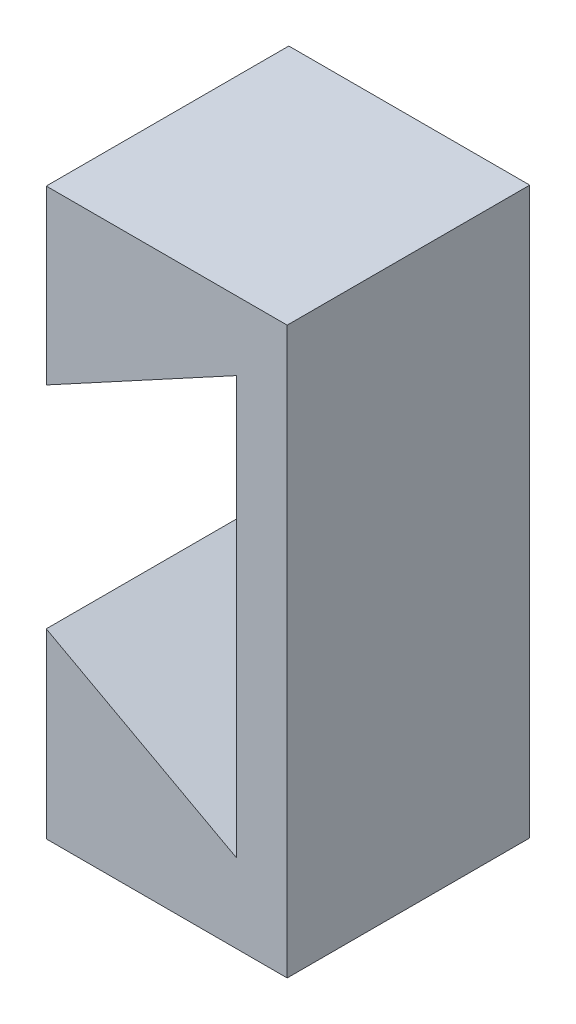
ISO-10303-21;
HEADER;
FILE_DESCRIPTION(('STEP AP214'),'2;1');
FILE_NAME('part.step','',(''),(''),'','','');
FILE_SCHEMA(('AUTOMOTIVE_DESIGN { 1 0 10303 214 1 1 1 1 }'));
ENDSEC;
DATA;
#1=APPLICATION_CONTEXT('core data for automotive mechanical design processes');
#2=APPLICATION_PROTOCOL_DEFINITION('international standard','automotive_design',2000,#1);
#3=PRODUCT_CONTEXT('',#1,'mechanical');
#4=PRODUCT('Part','Part','',(#3));
#5=PRODUCT_RELATED_PRODUCT_CATEGORY('part','',(#4));
#6=PRODUCT_DEFINITION_FORMATION('','',#4);
#7=PRODUCT_DEFINITION_CONTEXT('part definition',#1,'design');
#8=PRODUCT_DEFINITION('design','',#6,#7);
#9=PRODUCT_DEFINITION_SHAPE('','',#8);
#10=(LENGTH_UNIT() NAMED_UNIT(*) SI_UNIT(.MILLI.,.METRE.));
#11=(NAMED_UNIT(*) PLANE_ANGLE_UNIT() SI_UNIT($,.RADIAN.));
#12=(NAMED_UNIT(*) SI_UNIT($,.STERADIAN.) SOLID_ANGLE_UNIT());
#13=UNCERTAINTY_MEASURE_WITH_UNIT(LENGTH_MEASURE(1.E-05),#10,'distance_accuracy_value','');
#14=(GEOMETRIC_REPRESENTATION_CONTEXT(3) GLOBAL_UNCERTAINTY_ASSIGNED_CONTEXT((#13)) GLOBAL_UNIT_ASSIGNED_CONTEXT((#10,
#11,#12)) REPRESENTATION_CONTEXT('',''));
#15=CARTESIAN_POINT('',(0.,0.,0.));
#16=DIRECTION('',(0.,0.,1.));
#17=DIRECTION('',(1.,0.,0.));
#18=AXIS2_PLACEMENT_3D('',#15,#16,#17);
#19=CARTESIAN_POINT('',(130.896291351817,38.0210152059206,-115.01));
#20=DIRECTION('',(1.,0.,0.));
#21=DIRECTION('',(0.,0.,-1.));
#22=AXIS2_PLACEMENT_3D('',#19,#20,#21);
#23=PLANE('',#22);
#24=DIRECTION('',(0.,0.,-1.));
#25=VECTOR('',#24,1.);
#26=CARTESIAN_POINT('',(130.896291351817,48.9858851943017,141.53588771213));
#27=LINE('',#26,#25);
#28=CARTESIAN_POINT('',(130.896291351817,48.9858851943017,-99.5612445611803));
#29=VERTEX_POINT('',#28);
#30=CARTESIAN_POINT('',(130.896291351817,48.9858851943017,-115.));
#31=VERTEX_POINT('',#30);
#32=EDGE_CURVE('E153',#29,#31,#27,.T.);
#33=ORIENTED_EDGE('',*,*,#32,.T.);
#34=DIRECTION('',(0.,-1.,0.));
#35=VECTOR('',#34,1.);
#36=CARTESIAN_POINT('',(130.896291351817,70.,-115.));
#37=LINE('',#36,#35);
#38=CARTESIAN_POINT('',(130.896291351817,38.0210152059206,-115.));
#39=VERTEX_POINT('',#38);
#40=EDGE_CURVE('E68',#31,#39,#37,.T.);
#41=ORIENTED_EDGE('',*,*,#40,.T.);
#42=DIRECTION('',(0.,0.,1.));
#43=VECTOR('',#42,1.);
#44=CARTESIAN_POINT('',(130.896291351817,38.0210152059206,-115.01));
#45=LINE('',#44,#43);
#46=CARTESIAN_POINT('',(130.896291351817,38.0210152059206,-99.5612445611803));
#47=VERTEX_POINT('',#46);
#48=EDGE_CURVE('E11',#39,#47,#45,.T.);
#49=ORIENTED_EDGE('',*,*,#48,.T.);
#50=DIRECTION('',(0.,1.,0.));
#51=VECTOR('',#50,1.);
#52=CARTESIAN_POINT('',(130.896291351817,0.,-99.5612445611803));
#53=LINE('',#52,#51);
#54=EDGE_CURVE('E154',#47,#29,#53,.T.);
#55=ORIENTED_EDGE('',*,*,#54,.T.);
#56=EDGE_LOOP('',(#33,#41,#49,#55));
#57=FACE_BOUND('',#56,.T.);
#58=ADVANCED_FACE('F43',(#57),#23,.F.);
#59=CARTESIAN_POINT('',(142.996381437181,44.5862853397348,-115.01));
#60=DIRECTION('',(-0.476903884965473,0.878955450807854,0.));
#61=DIRECTION('',(-0.878955450807855,-0.476903884965473,0.));
#62=AXIS2_PLACEMENT_3D('',#59,#60,#61);
#63=PLANE('',#62);
#64=DIRECTION('',(0.878955450807855,0.476903884965473,0.));
#65=VECTOR('',#64,1.);
#66=CARTESIAN_POINT('',(39.0827805364028,-11.7951841929755,-115.));
#67=LINE('',#66,#65);
#68=CARTESIAN_POINT('',(142.996381437181,44.5862853397348,-115.));
#69=VERTEX_POINT('',#68);
#70=EDGE_CURVE('E146',#39,#69,#67,.T.);
#71=ORIENTED_EDGE('',*,*,#70,.T.);
#72=DIRECTION('',(0.,0.,1.));
#73=VECTOR('',#72,1.);
#74=CARTESIAN_POINT('',(142.996381437181,44.5862853397348,-115.01));
#75=LINE('',#74,#73);
#76=CARTESIAN_POINT('',(142.996381437181,44.5862853397348,-99.5612445611803));
#77=VERTEX_POINT('',#76);
#78=EDGE_CURVE('E52',#69,#77,#75,.T.);
#79=ORIENTED_EDGE('',*,*,#78,.T.);
#80=DIRECTION('',(-0.878955450807855,-0.476903884965473,0.));
#81=VECTOR('',#80,1.);
#82=CARTESIAN_POINT('',(13.8331557870303,-25.4951323824186,-99.5612445611803));
#83=LINE('',#82,#81);
#84=EDGE_CURVE('E156',#77,#47,#83,.T.);
#85=ORIENTED_EDGE('',*,*,#84,.T.);
#86=ORIENTED_EDGE('',*,*,#48,.F.);
#87=EDGE_LOOP('',(#71,#79,#85,#86));
#88=FACE_BOUND('',#87,.T.);
#89=ADVANCED_FACE('F186',(#88),#63,.F.);
#90=CARTESIAN_POINT('',(142.996381437181,44.5862853397348,-115.01));
#91=DIRECTION('',(1.,0.,0.));
#92=DIRECTION('',(0.,0.,-1.));
#93=AXIS2_PLACEMENT_3D('',#90,#91,#92);
#94=PLANE('',#93);
#95=DIRECTION('',(0.,-1.,0.));
#96=VECTOR('',#95,1.);
#97=CARTESIAN_POINT('',(142.996381437181,70.,-115.));
#98=LINE('',#97,#96);
#99=CARTESIAN_POINT('',(142.996381437181,18.0143801043625,-115.));
#100=VERTEX_POINT('',#99);
#101=EDGE_CURVE('E148',#69,#100,#98,.T.);
#102=ORIENTED_EDGE('',*,*,#101,.T.);
#103=DIRECTION('',(0.,0.,1.));
#104=VECTOR('',#103,1.);
#105=CARTESIAN_POINT('',(142.996381437181,18.0143801043625,-115.01));
#106=LINE('',#105,#104);
#107=CARTESIAN_POINT('',(142.996381437181,18.0143801043625,-99.5612445611803));
#108=VERTEX_POINT('',#107);
#109=EDGE_CURVE('E169',#100,#108,#106,.T.);
#110=ORIENTED_EDGE('',*,*,#109,.T.);
#111=DIRECTION('',(0.,1.,0.));
#112=VECTOR('',#111,1.);
#113=CARTESIAN_POINT('',(142.996381437181,0.,-99.5612445611803));
#114=LINE('',#113,#112);
#115=EDGE_CURVE('E159',#108,#77,#114,.T.);
#116=ORIENTED_EDGE('',*,*,#115,.T.);
#117=ORIENTED_EDGE('',*,*,#78,.F.);
#118=EDGE_LOOP('',(#102,#110,#116,#117));
#119=FACE_BOUND('',#118,.T.);
#120=ADVANCED_FACE('F184',(#119),#94,.F.);
#121=CARTESIAN_POINT('',(142.996381437181,18.0143801043625,-115.01));
#122=DIRECTION('',(-0.47690388496548,-0.878955450807851,0.));
#123=DIRECTION('',(0.878955450807851,-0.47690388496548,0.));
#124=AXIS2_PLACEMENT_3D('',#121,#122,#123);
#125=PLANE('',#124);
#126=DIRECTION('',(-0.878955450807851,0.47690388496548,0.));
#127=VECTOR('',#126,1.);
#128=CARTESIAN_POINT('',(6.63873883922034,91.9993465095802,-115.));
#129=LINE('',#128,#127);
#130=CARTESIAN_POINT('',(130.896291351817,24.5796502381768,-115.));
#131=VERTEX_POINT('',#130);
#132=EDGE_CURVE('E150',#100,#131,#129,.T.);
#133=ORIENTED_EDGE('',*,*,#132,.T.);
#134=DIRECTION('',(0.,0.,1.));
#135=VECTOR('',#134,1.);
#136=CARTESIAN_POINT('',(130.896291351817,24.5796502381768,-115.01));
#137=LINE('',#136,#135);
#138=CARTESIAN_POINT('',(130.896291351817,24.5796502381768,-99.5612445611803));
#139=VERTEX_POINT('',#138);
#140=EDGE_CURVE('E145',#131,#139,#137,.T.);
#141=ORIENTED_EDGE('',*,*,#140,.T.);
#142=DIRECTION('',(0.878955450807851,-0.47690388496548,0.));
#143=VECTOR('',#142,1.);
#144=CARTESIAN_POINT('',(40.0739317781063,73.8580705297002,-99.5612445611803));
#145=LINE('',#144,#143);
#146=EDGE_CURVE('E162',#139,#108,#145,.T.);
#147=ORIENTED_EDGE('',*,*,#146,.T.);
#148=ORIENTED_EDGE('',*,*,#109,.F.);
#149=EDGE_LOOP('',(#133,#141,#147,#148));
#150=FACE_BOUND('',#149,.T.);
#151=ADVANCED_FACE('F179',(#150),#125,.F.);
#152=CARTESIAN_POINT('',(130.896291351817,-0.0543782899306134,-115.01));
#153=DIRECTION('',(1.,0.,0.));
#154=DIRECTION('',(0.,1.,0.));
#155=AXIS2_PLACEMENT_3D('',#152,#153,#154);
#156=PLANE('',#155);
#157=DIRECTION('',(0.,0.,1.));
#158=VECTOR('',#157,1.);
#159=CARTESIAN_POINT('',(130.896291351817,12.9995888278982,141.53588771213));
#160=LINE('',#159,#158);
#161=CARTESIAN_POINT('',(130.896291351817,12.9995888278982,-115.));
#162=VERTEX_POINT('',#161);
#163=CARTESIAN_POINT('',(130.896291351817,12.9995888278982,-99.5612445611803));
#164=VERTEX_POINT('',#163);
#165=EDGE_CURVE('E47',#162,#164,#160,.T.);
#166=ORIENTED_EDGE('',*,*,#165,.T.);
#167=DIRECTION('',(0.,1.,0.));
#168=VECTOR('',#167,1.);
#169=CARTESIAN_POINT('',(130.896291351817,-1.4748306020168E-13,-99.5612445611803));
#170=LINE('',#169,#168);
#171=EDGE_CURVE('E143',#164,#139,#170,.T.);
#172=ORIENTED_EDGE('',*,*,#171,.T.);
#173=ORIENTED_EDGE('',*,*,#140,.F.);
#174=DIRECTION('',(0.,-1.,0.));
#175=VECTOR('',#174,1.);
#176=CARTESIAN_POINT('',(130.896291351818,69.9999999999999,-115.));
#177=LINE('',#176,#175);
#178=EDGE_CURVE('E60',#131,#162,#177,.T.);
#179=ORIENTED_EDGE('',*,*,#178,.T.);
#180=EDGE_LOOP('',(#166,#172,#173,#179));
#181=FACE_BOUND('',#180,.T.);
#182=ADVANCED_FACE('F45',(#181),#156,.F.);
#183=CARTESIAN_POINT('',(0.,0.,-99.5612445611803));
#184=DIRECTION('',(0.,0.,1.));
#185=DIRECTION('',(1.,0.,0.));
#186=AXIS2_PLACEMENT_3D('',#183,#184,#185);
#187=PLANE('',#186);
#188=ORIENTED_EDGE('',*,*,#171,.F.);
#189=DIRECTION('',(1.,0.,0.));
#190=VECTOR('',#189,1.);
#191=CARTESIAN_POINT('',(0.,12.9995888278982,-99.5612445611803));
#192=LINE('',#191,#190);
#193=CARTESIAN_POINT('',(146.231375556178,12.9995888278982,-99.5612445611803));
#194=VERTEX_POINT('',#193);
#195=EDGE_CURVE('E141',#164,#194,#192,.T.);
#196=ORIENTED_EDGE('',*,*,#195,.T.);
#197=DIRECTION('',(0.,1.,0.));
#198=VECTOR('',#197,1.);
#199=CARTESIAN_POINT('',(146.231375556178,0.,-99.5612445611803));
#200=LINE('',#199,#198);
#201=CARTESIAN_POINT('',(146.231375556178,48.9858851943017,-99.5612445611803));
#202=VERTEX_POINT('',#201);
#203=EDGE_CURVE('E121',#194,#202,#200,.T.);
#204=ORIENTED_EDGE('',*,*,#203,.T.);
#205=DIRECTION('',(-1.,0.,0.));
#206=VECTOR('',#205,1.);
#207=CARTESIAN_POINT('',(0.,48.9858851943017,-99.5612445611803));
#208=LINE('',#207,#206);
#209=EDGE_CURVE('E124',#202,#29,#208,.T.);
#210=ORIENTED_EDGE('',*,*,#209,.T.);
#211=ORIENTED_EDGE('',*,*,#54,.F.);
#212=ORIENTED_EDGE('',*,*,#84,.F.);
#213=ORIENTED_EDGE('',*,*,#115,.F.);
#214=ORIENTED_EDGE('',*,*,#146,.F.);
#215=EDGE_LOOP('',(#188,#196,#204,#210,#211,#212,#213,#214));
#216=FACE_BOUND('',#215,.T.);
#217=ADVANCED_FACE('F176',(#216),#187,.T.);
#218=CARTESIAN_POINT('',(146.231375556178,12.9995888278982,141.53588771213));
#219=DIRECTION('',(0.,-1.,0.));
#220=DIRECTION('',(0.,0.,-1.));
#221=AXIS2_PLACEMENT_3D('',#218,#219,#220);
#222=PLANE('',#221);
#223=ORIENTED_EDGE('',*,*,#165,.F.);
#224=DIRECTION('',(-1.,0.,0.));
#225=VECTOR('',#224,1.);
#226=CARTESIAN_POINT('',(146.231375556178,12.9995888278982,-115.));
#227=LINE('',#226,#225);
#228=CARTESIAN_POINT('',(146.231375556178,12.9995888278982,-115.));
#229=VERTEX_POINT('',#228);
#230=EDGE_CURVE('E128',#229,#162,#227,.T.);
#231=ORIENTED_EDGE('',*,*,#230,.F.);
#232=DIRECTION('',(0.,0.,-1.));
#233=VECTOR('',#232,1.);
#234=CARTESIAN_POINT('',(146.231375556178,12.9995888278982,141.53588771213));
#235=LINE('',#234,#233);
#236=EDGE_CURVE('E113',#194,#229,#235,.T.);
#237=ORIENTED_EDGE('',*,*,#236,.F.);
#238=ORIENTED_EDGE('',*,*,#195,.F.);
#239=EDGE_LOOP('',(#223,#231,#237,#238));
#240=FACE_BOUND('',#239,.T.);
#241=ADVANCED_FACE('F129',(#240),#222,.T.);
#242=CARTESIAN_POINT('',(146.231375556178,48.9858851943017,141.53588771213));
#243=DIRECTION('',(1.,0.,0.));
#244=DIRECTION('',(0.,0.,-1.));
#245=AXIS2_PLACEMENT_3D('',#242,#243,#244);
#246=PLANE('',#245);
#247=ORIENTED_EDGE('',*,*,#236,.T.);
#248=DIRECTION('',(0.,-1.,0.));
#249=VECTOR('',#248,1.);
#250=CARTESIAN_POINT('',(146.231375556178,48.9858851943017,-115.));
#251=LINE('',#250,#249);
#252=CARTESIAN_POINT('',(146.231375556178,48.9858851943017,-115.));
#253=VERTEX_POINT('',#252);
#254=EDGE_CURVE('E118',#253,#229,#251,.T.);
#255=ORIENTED_EDGE('',*,*,#254,.F.);
#256=DIRECTION('',(0.,0.,-1.));
#257=VECTOR('',#256,1.);
#258=CARTESIAN_POINT('',(146.231375556178,48.9858851943017,141.53588771213));
#259=LINE('',#258,#257);
#260=EDGE_CURVE('E125',#202,#253,#259,.T.);
#261=ORIENTED_EDGE('',*,*,#260,.F.);
#262=ORIENTED_EDGE('',*,*,#203,.F.);
#263=EDGE_LOOP('',(#247,#255,#261,#262));
#264=FACE_BOUND('',#263,.T.);
#265=ADVANCED_FACE('F115',(#264),#246,.T.);
#266=CARTESIAN_POINT('',(130.896291351817,48.9858851943017,141.53588771213));
#267=DIRECTION('',(0.,1.,0.));
#268=DIRECTION('',(0.,0.,1.));
#269=AXIS2_PLACEMENT_3D('',#266,#267,#268);
#270=PLANE('',#269);
#271=ORIENTED_EDGE('',*,*,#32,.F.);
#272=ORIENTED_EDGE('',*,*,#209,.F.);
#273=ORIENTED_EDGE('',*,*,#260,.T.);
#274=DIRECTION('',(1.,0.,0.));
#275=VECTOR('',#274,1.);
#276=CARTESIAN_POINT('',(130.896291351817,48.9858851943017,-115.));
#277=LINE('',#276,#275);
#278=EDGE_CURVE('E133',#31,#253,#277,.T.);
#279=ORIENTED_EDGE('',*,*,#278,.F.);
#280=EDGE_LOOP('',(#271,#272,#273,#279));
#281=FACE_BOUND('',#280,.T.);
#282=ADVANCED_FACE('F189',(#281),#270,.T.);
#283=CARTESIAN_POINT('',(-5.2976725084512,70.,-115.));
#284=DIRECTION('',(0.,0.,-1.));
#285=DIRECTION('',(-1.,0.,0.));
#286=AXIS2_PLACEMENT_3D('',#283,#284,#285);
#287=PLANE('',#286);
#288=ORIENTED_EDGE('',*,*,#178,.F.);
#289=ORIENTED_EDGE('',*,*,#132,.F.);
#290=ORIENTED_EDGE('',*,*,#101,.F.);
#291=ORIENTED_EDGE('',*,*,#70,.F.);
#292=ORIENTED_EDGE('',*,*,#40,.F.);
#293=ORIENTED_EDGE('',*,*,#278,.T.);
#294=ORIENTED_EDGE('',*,*,#254,.T.);
#295=ORIENTED_EDGE('',*,*,#230,.T.);
#296=EDGE_LOOP('',(#288,#289,#290,#291,#292,#293,#294,#295));
#297=FACE_BOUND('',#296,.T.);
#298=ADVANCED_FACE('F131',(#297),#287,.T.);
#299=CLOSED_SHELL('',(#58,#89,#120,#151,#182,#217,#241,#265,#282,#298));
#300=MANIFOLD_SOLID_BREP('B2',#299);
#301=ADVANCED_BREP_SHAPE_REPRESENTATION('',(#18,#300),#14);
#302=SHAPE_DEFINITION_REPRESENTATION(#9,#301);
ENDSEC;
END-ISO-10303-21;
